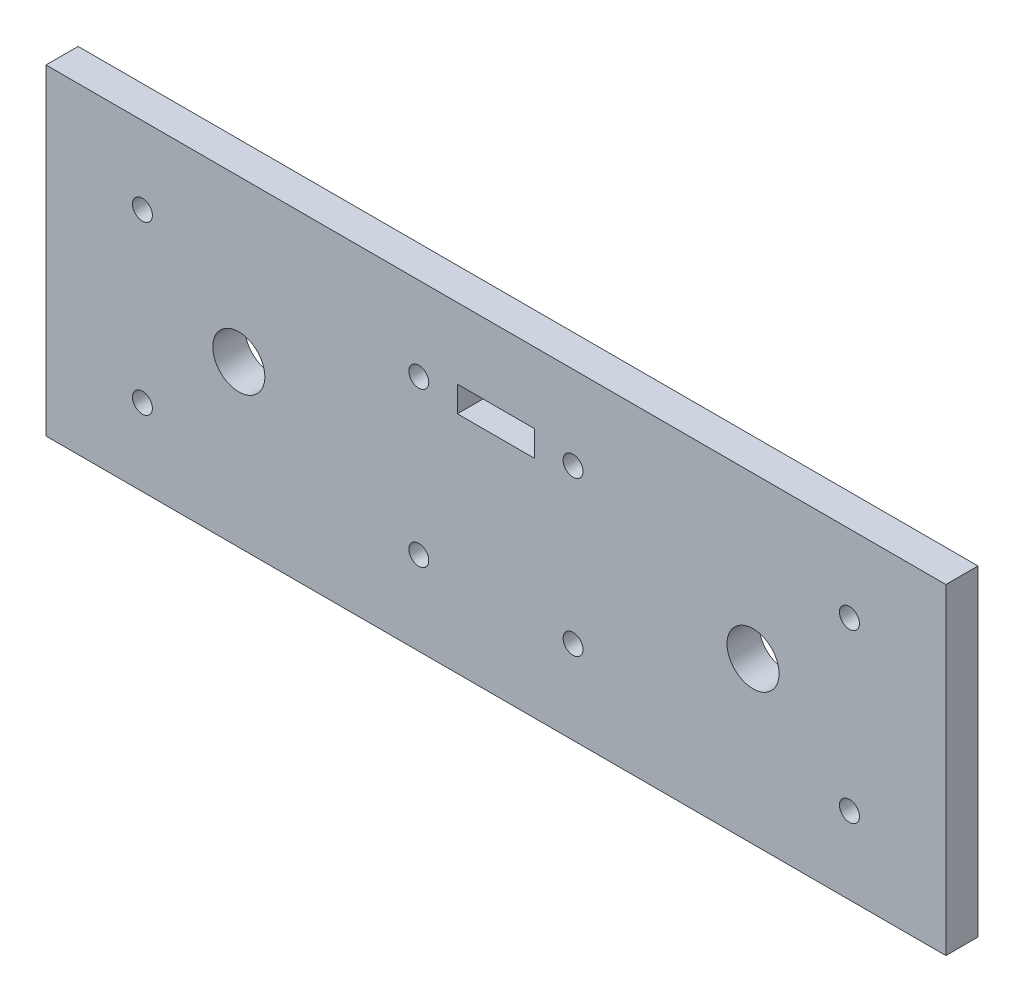
ISO-10303-21;
HEADER;
FILE_DESCRIPTION(('STEP AP214'),'2;1');
FILE_NAME('part.step','',(''),(''),'','','');
FILE_SCHEMA(('AUTOMOTIVE_DESIGN { 1 0 10303 214 1 1 1 1 }'));
ENDSEC;
DATA;
#1=APPLICATION_CONTEXT('core data for automotive mechanical design processes');
#2=APPLICATION_PROTOCOL_DEFINITION('international standard','automotive_design',2000,#1);
#3=PRODUCT_CONTEXT('',#1,'mechanical');
#4=PRODUCT('Part','Part','',(#3));
#5=PRODUCT_RELATED_PRODUCT_CATEGORY('part','',(#4));
#6=PRODUCT_DEFINITION_FORMATION('','',#4);
#7=PRODUCT_DEFINITION_CONTEXT('part definition',#1,'design');
#8=PRODUCT_DEFINITION('design','',#6,#7);
#9=PRODUCT_DEFINITION_SHAPE('','',#8);
#10=(LENGTH_UNIT() NAMED_UNIT(*) SI_UNIT(.MILLI.,.METRE.));
#11=(NAMED_UNIT(*) PLANE_ANGLE_UNIT() SI_UNIT($,.RADIAN.));
#12=(NAMED_UNIT(*) SI_UNIT($,.STERADIAN.) SOLID_ANGLE_UNIT());
#13=UNCERTAINTY_MEASURE_WITH_UNIT(LENGTH_MEASURE(1.E-05),#10,'distance_accuracy_value','');
#14=(GEOMETRIC_REPRESENTATION_CONTEXT(3) GLOBAL_UNCERTAINTY_ASSIGNED_CONTEXT((#13)) GLOBAL_UNIT_ASSIGNED_CONTEXT((#10,
#11,#12)) REPRESENTATION_CONTEXT('',''));
#15=CARTESIAN_POINT('',(0.,0.,0.));
#16=DIRECTION('',(0.,0.,1.));
#17=DIRECTION('',(1.,0.,0.));
#18=AXIS2_PLACEMENT_3D('',#15,#16,#17);
#19=CARTESIAN_POINT('',(70.,-25.,-5.));
#20=DIRECTION('',(1.,0.,0.));
#21=DIRECTION('',(0.,0.,-1.));
#22=AXIS2_PLACEMENT_3D('',#19,#20,#21);
#23=PLANE('',#22);
#24=DIRECTION('',(0.,1.,0.));
#25=VECTOR('',#24,1.);
#26=CARTESIAN_POINT('',(70.,-25.,0.));
#27=LINE('',#26,#25);
#28=CARTESIAN_POINT('',(70.,-25.,0.));
#29=VERTEX_POINT('',#28);
#30=CARTESIAN_POINT('',(70.,25.,0.));
#31=VERTEX_POINT('',#30);
#32=EDGE_CURVE('E145',#29,#31,#27,.T.);
#33=ORIENTED_EDGE('',*,*,#32,.F.);
#34=DIRECTION('',(0.,0.,1.));
#35=VECTOR('',#34,1.);
#36=CARTESIAN_POINT('',(70.,-25.,-5.));
#37=LINE('',#36,#35);
#38=CARTESIAN_POINT('',(70.,-25.,-5.));
#39=VERTEX_POINT('',#38);
#40=EDGE_CURVE('E13',#39,#29,#37,.T.);
#41=ORIENTED_EDGE('',*,*,#40,.F.);
#42=DIRECTION('',(0.,1.,0.));
#43=VECTOR('',#42,1.);
#44=CARTESIAN_POINT('',(70.,-25.,-5.));
#45=LINE('',#44,#43);
#46=CARTESIAN_POINT('',(70.,25.,-5.));
#47=VERTEX_POINT('',#46);
#48=EDGE_CURVE('E149',#39,#47,#45,.T.);
#49=ORIENTED_EDGE('',*,*,#48,.T.);
#50=DIRECTION('',(0.,0.,1.));
#51=VECTOR('',#50,1.);
#52=CARTESIAN_POINT('',(70.,25.,-5.));
#53=LINE('',#52,#51);
#54=EDGE_CURVE('E46',#47,#31,#53,.T.);
#55=ORIENTED_EDGE('',*,*,#54,.T.);
#56=EDGE_LOOP('',(#33,#41,#49,#55));
#57=FACE_BOUND('',#56,.T.);
#58=ADVANCED_FACE('F43',(#57),#23,.T.);
#59=CARTESIAN_POINT('',(-70.,-25.,-5.));
#60=DIRECTION('',(0.,-1.,0.));
#61=DIRECTION('',(0.,0.,-1.));
#62=AXIS2_PLACEMENT_3D('',#59,#60,#61);
#63=PLANE('',#62);
#64=DIRECTION('',(1.,0.,0.));
#65=VECTOR('',#64,1.);
#66=CARTESIAN_POINT('',(-70.,-25.,0.));
#67=LINE('',#66,#65);
#68=CARTESIAN_POINT('',(-70.,-25.,0.));
#69=VERTEX_POINT('',#68);
#70=EDGE_CURVE('E153',#69,#29,#67,.T.);
#71=ORIENTED_EDGE('',*,*,#70,.F.);
#72=DIRECTION('',(0.,0.,1.));
#73=VECTOR('',#72,1.);
#74=CARTESIAN_POINT('',(-70.,-25.,-5.));
#75=LINE('',#74,#73);
#76=CARTESIAN_POINT('',(-70.,-25.,-5.));
#77=VERTEX_POINT('',#76);
#78=EDGE_CURVE('E51',#77,#69,#75,.T.);
#79=ORIENTED_EDGE('',*,*,#78,.F.);
#80=DIRECTION('',(1.,0.,0.));
#81=VECTOR('',#80,1.);
#82=CARTESIAN_POINT('',(-70.,-25.,-5.));
#83=LINE('',#82,#81);
#84=EDGE_CURVE('E159',#77,#39,#83,.T.);
#85=ORIENTED_EDGE('',*,*,#84,.T.);
#86=ORIENTED_EDGE('',*,*,#40,.T.);
#87=EDGE_LOOP('',(#71,#79,#85,#86));
#88=FACE_BOUND('',#87,.T.);
#89=ADVANCED_FACE('F185',(#88),#63,.T.);
#90=CARTESIAN_POINT('',(-70.,-25.,-5.));
#91=DIRECTION('',(-1.,0.,0.));
#92=DIRECTION('',(0.,0.,1.));
#93=AXIS2_PLACEMENT_3D('',#90,#91,#92);
#94=PLANE('',#93);
#95=DIRECTION('',(0.,-1.,0.));
#96=VECTOR('',#95,1.);
#97=CARTESIAN_POINT('',(-70.,-25.,0.));
#98=LINE('',#97,#96);
#99=CARTESIAN_POINT('',(-70.,25.,0.));
#100=VERTEX_POINT('',#99);
#101=EDGE_CURVE('E167',#100,#69,#98,.T.);
#102=ORIENTED_EDGE('',*,*,#101,.F.);
#103=DIRECTION('',(0.,0.,1.));
#104=VECTOR('',#103,1.);
#105=CARTESIAN_POINT('',(-70.,25.,-5.));
#106=LINE('',#105,#104);
#107=CARTESIAN_POINT('',(-70.,25.,-5.));
#108=VERTEX_POINT('',#107);
#109=EDGE_CURVE('E172',#108,#100,#106,.T.);
#110=ORIENTED_EDGE('',*,*,#109,.F.);
#111=DIRECTION('',(0.,-1.,0.));
#112=VECTOR('',#111,1.);
#113=CARTESIAN_POINT('',(-70.,-25.,-5.));
#114=LINE('',#113,#112);
#115=EDGE_CURVE('E156',#108,#77,#114,.T.);
#116=ORIENTED_EDGE('',*,*,#115,.T.);
#117=ORIENTED_EDGE('',*,*,#78,.T.);
#118=EDGE_LOOP('',(#102,#110,#116,#117));
#119=FACE_BOUND('',#118,.T.);
#120=ADVANCED_FACE('F189',(#119),#94,.T.);
#121=CARTESIAN_POINT('',(-70.,25.,-5.));
#122=DIRECTION('',(0.,1.,0.));
#123=DIRECTION('',(0.,0.,1.));
#124=AXIS2_PLACEMENT_3D('',#121,#122,#123);
#125=PLANE('',#124);
#126=DIRECTION('',(-1.,0.,0.));
#127=VECTOR('',#126,1.);
#128=CARTESIAN_POINT('',(-70.,25.,0.));
#129=LINE('',#128,#127);
#130=EDGE_CURVE('E164',#31,#100,#129,.T.);
#131=ORIENTED_EDGE('',*,*,#130,.F.);
#132=ORIENTED_EDGE('',*,*,#54,.F.);
#133=DIRECTION('',(-1.,0.,0.));
#134=VECTOR('',#133,1.);
#135=CARTESIAN_POINT('',(-70.,25.,-5.));
#136=LINE('',#135,#134);
#137=EDGE_CURVE('E152',#47,#108,#136,.T.);
#138=ORIENTED_EDGE('',*,*,#137,.T.);
#139=ORIENTED_EDGE('',*,*,#109,.T.);
#140=EDGE_LOOP('',(#131,#132,#138,#139));
#141=FACE_BOUND('',#140,.T.);
#142=ADVANCED_FACE('F180',(#141),#125,.T.);
#143=CARTESIAN_POINT('',(0.,0.,-5.));
#144=DIRECTION('',(0.,0.,-1.));
#145=DIRECTION('',(-1.,0.,0.));
#146=AXIS2_PLACEMENT_3D('',#143,#144,#145);
#147=PLANE('',#146);
#148=CARTESIAN_POINT('',(12.,12.,-5.));
#149=DIRECTION('',(0.,0.,1.));
#150=DIRECTION('',(-1.,0.,0.));
#151=AXIS2_PLACEMENT_3D('',#148,#149,#150);
#152=CIRCLE('',#151,1.55);
#153=CARTESIAN_POINT('',(10.45,12.,-5.));
#154=VERTEX_POINT('',#153);
#155=EDGE_CURVE('E374',#154,#154,#152,.T.);
#156=ORIENTED_EDGE('',*,*,#155,.T.);
#157=EDGE_LOOP('',(#156));
#158=FACE_BOUND('',#157,.T.);
#159=CARTESIAN_POINT('',(12.,-12.,-5.));
#160=DIRECTION('',(0.,0.,1.));
#161=DIRECTION('',(1.,0.,0.));
#162=AXIS2_PLACEMENT_3D('',#159,#160,#161);
#163=CIRCLE('',#162,1.55);
#164=CARTESIAN_POINT('',(13.55,-12.,-5.));
#165=VERTEX_POINT('',#164);
#166=EDGE_CURVE('E382',#165,#165,#163,.T.);
#167=ORIENTED_EDGE('',*,*,#166,.T.);
#168=EDGE_LOOP('',(#167));
#169=FACE_BOUND('',#168,.T.);
#170=CARTESIAN_POINT('',(-12.,-12.,-5.));
#171=DIRECTION('',(0.,0.,1.));
#172=DIRECTION('',(-1.,0.,0.));
#173=AXIS2_PLACEMENT_3D('',#170,#171,#172);
#174=CIRCLE('',#173,1.55);
#175=CARTESIAN_POINT('',(-13.55,-12.,-5.));
#176=VERTEX_POINT('',#175);
#177=EDGE_CURVE('E388',#176,#176,#174,.T.);
#178=ORIENTED_EDGE('',*,*,#177,.T.);
#179=EDGE_LOOP('',(#178));
#180=FACE_BOUND('',#179,.T.);
#181=CARTESIAN_POINT('',(-55.,-13.,-5.));
#182=DIRECTION('',(0.,0.,1.));
#183=DIRECTION('',(1.,0.,0.));
#184=AXIS2_PLACEMENT_3D('',#181,#182,#183);
#185=CIRCLE('',#184,1.55);
#186=CARTESIAN_POINT('',(-53.45,-13.,-5.));
#187=VERTEX_POINT('',#186);
#188=EDGE_CURVE('E394',#187,#187,#185,.T.);
#189=ORIENTED_EDGE('',*,*,#188,.T.);
#190=EDGE_LOOP('',(#189));
#191=FACE_BOUND('',#190,.T.);
#192=CARTESIAN_POINT('',(-12.,12.,-5.));
#193=DIRECTION('',(0.,0.,1.));
#194=DIRECTION('',(1.,0.,0.));
#195=AXIS2_PLACEMENT_3D('',#192,#193,#194);
#196=CIRCLE('',#195,1.55);
#197=CARTESIAN_POINT('',(-10.45,12.,-5.));
#198=VERTEX_POINT('',#197);
#199=EDGE_CURVE('E400',#198,#198,#196,.T.);
#200=ORIENTED_EDGE('',*,*,#199,.T.);
#201=EDGE_LOOP('',(#200));
#202=FACE_BOUND('',#201,.T.);
#203=CARTESIAN_POINT('',(55.,13.,-5.));
#204=DIRECTION('',(0.,0.,1.));
#205=DIRECTION('',(1.,0.,0.));
#206=AXIS2_PLACEMENT_3D('',#203,#204,#205);
#207=CIRCLE('',#206,1.55);
#208=CARTESIAN_POINT('',(56.55,13.,-5.));
#209=VERTEX_POINT('',#208);
#210=EDGE_CURVE('E406',#209,#209,#207,.T.);
#211=ORIENTED_EDGE('',*,*,#210,.T.);
#212=EDGE_LOOP('',(#211));
#213=FACE_BOUND('',#212,.T.);
#214=CARTESIAN_POINT('',(55.,-13.,-5.));
#215=DIRECTION('',(0.,0.,1.));
#216=DIRECTION('',(-1.,0.,0.));
#217=AXIS2_PLACEMENT_3D('',#214,#215,#216);
#218=CIRCLE('',#217,1.55);
#219=CARTESIAN_POINT('',(53.45,-13.,-5.));
#220=VERTEX_POINT('',#219);
#221=EDGE_CURVE('E412',#220,#220,#218,.T.);
#222=ORIENTED_EDGE('',*,*,#221,.T.);
#223=EDGE_LOOP('',(#222));
#224=FACE_BOUND('',#223,.T.);
#225=CARTESIAN_POINT('',(-55.,13.,-5.));
#226=DIRECTION('',(0.,0.,1.));
#227=DIRECTION('',(-1.,0.,0.));
#228=AXIS2_PLACEMENT_3D('',#225,#226,#227);
#229=CIRCLE('',#228,1.55);
#230=CARTESIAN_POINT('',(-56.55,13.,-5.));
#231=VERTEX_POINT('',#230);
#232=EDGE_CURVE('E418',#231,#231,#229,.T.);
#233=ORIENTED_EDGE('',*,*,#232,.T.);
#234=EDGE_LOOP('',(#233));
#235=FACE_BOUND('',#234,.T.);
#236=CARTESIAN_POINT('',(40.,0.,-5.));
#237=DIRECTION('',(0.,0.,1.));
#238=DIRECTION('',(-1.,0.,0.));
#239=AXIS2_PLACEMENT_3D('',#236,#237,#238);
#240=CIRCLE('',#239,4.05);
#241=CARTESIAN_POINT('',(35.95,0.,-5.));
#242=VERTEX_POINT('',#241);
#243=EDGE_CURVE('E424',#242,#242,#240,.T.);
#244=ORIENTED_EDGE('',*,*,#243,.T.);
#245=EDGE_LOOP('',(#244));
#246=FACE_BOUND('',#245,.T.);
#247=CARTESIAN_POINT('',(-40.,0.,-5.));
#248=DIRECTION('',(0.,0.,1.));
#249=DIRECTION('',(1.,0.,0.));
#250=AXIS2_PLACEMENT_3D('',#247,#248,#249);
#251=CIRCLE('',#250,4.05);
#252=CARTESIAN_POINT('',(-35.95,0.,-5.));
#253=VERTEX_POINT('',#252);
#254=EDGE_CURVE('E139',#253,#253,#251,.T.);
#255=ORIENTED_EDGE('',*,*,#254,.T.);
#256=EDGE_LOOP('',(#255));
#257=FACE_BOUND('',#256,.T.);
#258=DIRECTION('',(0.,1.,0.));
#259=VECTOR('',#258,1.);
#260=CARTESIAN_POINT('',(5.99999999999998,10.,-5.));
#261=LINE('',#260,#259);
#262=CARTESIAN_POINT('',(5.99999999999998,10.,-5.));
#263=VERTEX_POINT('',#262);
#264=CARTESIAN_POINT('',(5.99999999999998,14.,-5.));
#265=VERTEX_POINT('',#264);
#266=EDGE_CURVE('E110',#263,#265,#261,.T.);
#267=ORIENTED_EDGE('',*,*,#266,.T.);
#268=DIRECTION('',(-1.,0.,0.));
#269=VECTOR('',#268,1.);
#270=CARTESIAN_POINT('',(-6.00000000000002,14.,-5.));
#271=LINE('',#270,#269);
#272=CARTESIAN_POINT('',(-6.00000000000002,14.,-5.));
#273=VERTEX_POINT('',#272);
#274=EDGE_CURVE('E119',#265,#273,#271,.T.);
#275=ORIENTED_EDGE('',*,*,#274,.T.);
#276=DIRECTION('',(0.,-1.,0.));
#277=VECTOR('',#276,1.);
#278=CARTESIAN_POINT('',(-6.00000000000002,10.,-5.));
#279=LINE('',#278,#277);
#280=CARTESIAN_POINT('',(-6.00000000000002,10.,-5.));
#281=VERTEX_POINT('',#280);
#282=EDGE_CURVE('E59',#273,#281,#279,.T.);
#283=ORIENTED_EDGE('',*,*,#282,.T.);
#284=DIRECTION('',(1.,0.,0.));
#285=VECTOR('',#284,1.);
#286=CARTESIAN_POINT('',(-6.00000000000002,10.,-5.));
#287=LINE('',#286,#285);
#288=EDGE_CURVE('E116',#281,#263,#287,.T.);
#289=ORIENTED_EDGE('',*,*,#288,.T.);
#290=EDGE_LOOP('',(#267,#275,#283,#289));
#291=FACE_BOUND('',#290,.T.);
#292=ORIENTED_EDGE('',*,*,#48,.F.);
#293=ORIENTED_EDGE('',*,*,#84,.F.);
#294=ORIENTED_EDGE('',*,*,#115,.F.);
#295=ORIENTED_EDGE('',*,*,#137,.F.);
#296=EDGE_LOOP('',(#292,#293,#294,#295));
#297=FACE_BOUND('',#296,.T.);
#298=ADVANCED_FACE('F123',(#158,#169,#180,#191,#202,#213,#224,#235,#246,#257,#291,#297),#147,.T.);
#299=CARTESIAN_POINT('',(0.,0.,0.));
#300=DIRECTION('',(0.,0.,-1.));
#301=DIRECTION('',(-1.,0.,0.));
#302=AXIS2_PLACEMENT_3D('',#299,#300,#301);
#303=PLANE('',#302);
#304=CARTESIAN_POINT('',(12.,12.,0.));
#305=DIRECTION('',(0.,0.,1.));
#306=DIRECTION('',(-1.,0.,0.));
#307=AXIS2_PLACEMENT_3D('',#304,#305,#306);
#308=CIRCLE('',#307,1.55);
#309=CARTESIAN_POINT('',(10.45,12.,0.));
#310=VERTEX_POINT('',#309);
#311=EDGE_CURVE('E377',#310,#310,#308,.T.);
#312=ORIENTED_EDGE('',*,*,#311,.F.);
#313=EDGE_LOOP('',(#312));
#314=FACE_BOUND('',#313,.T.);
#315=CARTESIAN_POINT('',(12.,-12.,0.));
#316=DIRECTION('',(0.,0.,1.));
#317=DIRECTION('',(1.,0.,0.));
#318=AXIS2_PLACEMENT_3D('',#315,#316,#317);
#319=CIRCLE('',#318,1.55);
#320=CARTESIAN_POINT('',(13.55,-12.,0.));
#321=VERTEX_POINT('',#320);
#322=EDGE_CURVE('E379',#321,#321,#319,.T.);
#323=ORIENTED_EDGE('',*,*,#322,.F.);
#324=EDGE_LOOP('',(#323));
#325=FACE_BOUND('',#324,.T.);
#326=CARTESIAN_POINT('',(-12.,-12.,0.));
#327=DIRECTION('',(0.,0.,1.));
#328=DIRECTION('',(-1.,0.,0.));
#329=AXIS2_PLACEMENT_3D('',#326,#327,#328);
#330=CIRCLE('',#329,1.55);
#331=CARTESIAN_POINT('',(-13.55,-12.,0.));
#332=VERTEX_POINT('',#331);
#333=EDGE_CURVE('E385',#332,#332,#330,.T.);
#334=ORIENTED_EDGE('',*,*,#333,.F.);
#335=EDGE_LOOP('',(#334));
#336=FACE_BOUND('',#335,.T.);
#337=CARTESIAN_POINT('',(-55.,-13.,0.));
#338=DIRECTION('',(0.,0.,1.));
#339=DIRECTION('',(1.,0.,0.));
#340=AXIS2_PLACEMENT_3D('',#337,#338,#339);
#341=CIRCLE('',#340,1.55);
#342=CARTESIAN_POINT('',(-53.45,-13.,0.));
#343=VERTEX_POINT('',#342);
#344=EDGE_CURVE('E391',#343,#343,#341,.T.);
#345=ORIENTED_EDGE('',*,*,#344,.F.);
#346=EDGE_LOOP('',(#345));
#347=FACE_BOUND('',#346,.T.);
#348=CARTESIAN_POINT('',(-12.,12.,0.));
#349=DIRECTION('',(0.,0.,1.));
#350=DIRECTION('',(1.,0.,0.));
#351=AXIS2_PLACEMENT_3D('',#348,#349,#350);
#352=CIRCLE('',#351,1.55);
#353=CARTESIAN_POINT('',(-10.45,12.,0.));
#354=VERTEX_POINT('',#353);
#355=EDGE_CURVE('E397',#354,#354,#352,.T.);
#356=ORIENTED_EDGE('',*,*,#355,.F.);
#357=EDGE_LOOP('',(#356));
#358=FACE_BOUND('',#357,.T.);
#359=CARTESIAN_POINT('',(55.,13.,0.));
#360=DIRECTION('',(0.,0.,1.));
#361=DIRECTION('',(1.,0.,0.));
#362=AXIS2_PLACEMENT_3D('',#359,#360,#361);
#363=CIRCLE('',#362,1.55);
#364=CARTESIAN_POINT('',(56.55,13.,0.));
#365=VERTEX_POINT('',#364);
#366=EDGE_CURVE('E403',#365,#365,#363,.T.);
#367=ORIENTED_EDGE('',*,*,#366,.F.);
#368=EDGE_LOOP('',(#367));
#369=FACE_BOUND('',#368,.T.);
#370=CARTESIAN_POINT('',(55.,-13.,0.));
#371=DIRECTION('',(0.,0.,1.));
#372=DIRECTION('',(-1.,0.,0.));
#373=AXIS2_PLACEMENT_3D('',#370,#371,#372);
#374=CIRCLE('',#373,1.55);
#375=CARTESIAN_POINT('',(53.45,-13.,0.));
#376=VERTEX_POINT('',#375);
#377=EDGE_CURVE('E409',#376,#376,#374,.T.);
#378=ORIENTED_EDGE('',*,*,#377,.F.);
#379=EDGE_LOOP('',(#378));
#380=FACE_BOUND('',#379,.T.);
#381=CARTESIAN_POINT('',(-55.,13.,0.));
#382=DIRECTION('',(0.,0.,1.));
#383=DIRECTION('',(-1.,0.,0.));
#384=AXIS2_PLACEMENT_3D('',#381,#382,#383);
#385=CIRCLE('',#384,1.55);
#386=CARTESIAN_POINT('',(-56.55,13.,0.));
#387=VERTEX_POINT('',#386);
#388=EDGE_CURVE('E415',#387,#387,#385,.T.);
#389=ORIENTED_EDGE('',*,*,#388,.F.);
#390=EDGE_LOOP('',(#389));
#391=FACE_BOUND('',#390,.T.);
#392=CARTESIAN_POINT('',(40.,0.,0.));
#393=DIRECTION('',(0.,0.,1.));
#394=DIRECTION('',(-1.,0.,0.));
#395=AXIS2_PLACEMENT_3D('',#392,#393,#394);
#396=CIRCLE('',#395,4.05);
#397=CARTESIAN_POINT('',(35.95,0.,0.));
#398=VERTEX_POINT('',#397);
#399=EDGE_CURVE('E421',#398,#398,#396,.T.);
#400=ORIENTED_EDGE('',*,*,#399,.F.);
#401=EDGE_LOOP('',(#400));
#402=FACE_BOUND('',#401,.T.);
#403=CARTESIAN_POINT('',(-40.,0.,0.));
#404=DIRECTION('',(0.,0.,1.));
#405=DIRECTION('',(1.,0.,0.));
#406=AXIS2_PLACEMENT_3D('',#403,#404,#405);
#407=CIRCLE('',#406,4.05);
#408=CARTESIAN_POINT('',(-35.95,0.,0.));
#409=VERTEX_POINT('',#408);
#410=EDGE_CURVE('E132',#409,#409,#407,.T.);
#411=ORIENTED_EDGE('',*,*,#410,.F.);
#412=EDGE_LOOP('',(#411));
#413=FACE_BOUND('',#412,.T.);
#414=DIRECTION('',(-1.,0.,0.));
#415=VECTOR('',#414,1.);
#416=CARTESIAN_POINT('',(-6.00000000000002,14.,0.));
#417=LINE('',#416,#415);
#418=CARTESIAN_POINT('',(5.99999999999998,14.,0.));
#419=VERTEX_POINT('',#418);
#420=CARTESIAN_POINT('',(-6.00000000000002,14.,0.));
#421=VERTEX_POINT('',#420);
#422=EDGE_CURVE('E138',#419,#421,#417,.T.);
#423=ORIENTED_EDGE('',*,*,#422,.F.);
#424=DIRECTION('',(0.,1.,0.));
#425=VECTOR('',#424,1.);
#426=CARTESIAN_POINT('',(5.99999999999998,10.,0.));
#427=LINE('',#426,#425);
#428=CARTESIAN_POINT('',(5.99999999999998,10.,0.));
#429=VERTEX_POINT('',#428);
#430=EDGE_CURVE('E67',#429,#419,#427,.T.);
#431=ORIENTED_EDGE('',*,*,#430,.F.);
#432=DIRECTION('',(1.,0.,0.));
#433=VECTOR('',#432,1.);
#434=CARTESIAN_POINT('',(-6.00000000000002,10.,0.));
#435=LINE('',#434,#433);
#436=CARTESIAN_POINT('',(-6.00000000000002,10.,0.));
#437=VERTEX_POINT('',#436);
#438=EDGE_CURVE('E126',#437,#429,#435,.T.);
#439=ORIENTED_EDGE('',*,*,#438,.F.);
#440=DIRECTION('',(0.,-1.,0.));
#441=VECTOR('',#440,1.);
#442=CARTESIAN_POINT('',(-6.00000000000002,10.,0.));
#443=LINE('',#442,#441);
#444=EDGE_CURVE('E129',#421,#437,#443,.T.);
#445=ORIENTED_EDGE('',*,*,#444,.F.);
#446=EDGE_LOOP('',(#423,#431,#439,#445));
#447=FACE_BOUND('',#446,.T.);
#448=ORIENTED_EDGE('',*,*,#32,.T.);
#449=ORIENTED_EDGE('',*,*,#130,.T.);
#450=ORIENTED_EDGE('',*,*,#101,.T.);
#451=ORIENTED_EDGE('',*,*,#70,.T.);
#452=EDGE_LOOP('',(#448,#449,#450,#451));
#453=FACE_BOUND('',#452,.T.);
#454=ADVANCED_FACE('F182',(#314,#325,#336,#347,#358,#369,#380,#391,#402,#413,#447,#453),#303,.F.);
#455=CARTESIAN_POINT('',(5.99999999999998,10.,-5.));
#456=DIRECTION('',(1.,0.,0.));
#457=DIRECTION('',(0.,0.,-1.));
#458=AXIS2_PLACEMENT_3D('',#455,#456,#457);
#459=PLANE('',#458);
#460=ORIENTED_EDGE('',*,*,#430,.T.);
#461=DIRECTION('',(0.,0.,1.));
#462=VECTOR('',#461,1.);
#463=CARTESIAN_POINT('',(5.99999999999998,14.,-5.));
#464=LINE('',#463,#462);
#465=EDGE_CURVE('E106',#265,#419,#464,.T.);
#466=ORIENTED_EDGE('',*,*,#465,.F.);
#467=ORIENTED_EDGE('',*,*,#266,.F.);
#468=DIRECTION('',(0.,0.,1.));
#469=VECTOR('',#468,1.);
#470=CARTESIAN_POINT('',(5.99999999999998,10.,-5.));
#471=LINE('',#470,#469);
#472=EDGE_CURVE('E143',#263,#429,#471,.T.);
#473=ORIENTED_EDGE('',*,*,#472,.T.);
#474=EDGE_LOOP('',(#460,#466,#467,#473));
#475=FACE_BOUND('',#474,.T.);
#476=ADVANCED_FACE('F108',(#475),#459,.F.);
#477=CARTESIAN_POINT('',(-6.00000000000002,10.,-5.));
#478=DIRECTION('',(0.,-1.,0.));
#479=DIRECTION('',(0.,0.,-1.));
#480=AXIS2_PLACEMENT_3D('',#477,#478,#479);
#481=PLANE('',#480);
#482=ORIENTED_EDGE('',*,*,#438,.T.);
#483=ORIENTED_EDGE('',*,*,#472,.F.);
#484=ORIENTED_EDGE('',*,*,#288,.F.);
#485=DIRECTION('',(0.,0.,1.));
#486=VECTOR('',#485,1.);
#487=CARTESIAN_POINT('',(-6.00000000000002,10.,-5.));
#488=LINE('',#487,#486);
#489=EDGE_CURVE('E146',#281,#437,#488,.T.);
#490=ORIENTED_EDGE('',*,*,#489,.T.);
#491=EDGE_LOOP('',(#482,#483,#484,#490));
#492=FACE_BOUND('',#491,.T.);
#493=ADVANCED_FACE('F241',(#492),#481,.F.);
#494=CARTESIAN_POINT('',(-6.00000000000002,10.,-5.));
#495=DIRECTION('',(-1.,0.,0.));
#496=DIRECTION('',(0.,0.,1.));
#497=AXIS2_PLACEMENT_3D('',#494,#495,#496);
#498=PLANE('',#497);
#499=ORIENTED_EDGE('',*,*,#444,.T.);
#500=ORIENTED_EDGE('',*,*,#489,.F.);
#501=ORIENTED_EDGE('',*,*,#282,.F.);
#502=DIRECTION('',(0.,0.,1.));
#503=VECTOR('',#502,1.);
#504=CARTESIAN_POINT('',(-6.00000000000002,14.,-5.));
#505=LINE('',#504,#503);
#506=EDGE_CURVE('E115',#273,#421,#505,.T.);
#507=ORIENTED_EDGE('',*,*,#506,.T.);
#508=EDGE_LOOP('',(#499,#500,#501,#507));
#509=FACE_BOUND('',#508,.T.);
#510=ADVANCED_FACE('F250',(#509),#498,.F.);
#511=CARTESIAN_POINT('',(-6.00000000000002,14.,-5.));
#512=DIRECTION('',(0.,1.,0.));
#513=DIRECTION('',(0.,0.,1.));
#514=AXIS2_PLACEMENT_3D('',#511,#512,#513);
#515=PLANE('',#514);
#516=ORIENTED_EDGE('',*,*,#422,.T.);
#517=ORIENTED_EDGE('',*,*,#506,.F.);
#518=ORIENTED_EDGE('',*,*,#274,.F.);
#519=ORIENTED_EDGE('',*,*,#465,.T.);
#520=EDGE_LOOP('',(#516,#517,#518,#519));
#521=FACE_BOUND('',#520,.T.);
#522=ADVANCED_FACE('F120',(#521),#515,.F.);
#523=CARTESIAN_POINT('',(-40.,0.,-5.));
#524=DIRECTION('',(0.,0.,1.));
#525=DIRECTION('',(1.,0.,0.));
#526=AXIS2_PLACEMENT_3D('',#523,#524,#525);
#527=CYLINDRICAL_SURFACE('',#526,4.05);
#528=ORIENTED_EDGE('',*,*,#254,.F.);
#529=EDGE_LOOP('',(#528));
#530=FACE_BOUND('',#529,.T.);
#531=ORIENTED_EDGE('',*,*,#410,.T.);
#532=EDGE_LOOP('',(#531));
#533=FACE_BOUND('',#532,.T.);
#534=ADVANCED_FACE('F268',(#530,#533),#527,.F.);
#535=CARTESIAN_POINT('',(40.,0.,-5.));
#536=DIRECTION('',(0.,0.,1.));
#537=DIRECTION('',(1.,0.,0.));
#538=AXIS2_PLACEMENT_3D('',#535,#536,#537);
#539=CYLINDRICAL_SURFACE('',#538,4.05);
#540=ORIENTED_EDGE('',*,*,#243,.F.);
#541=EDGE_LOOP('',(#540));
#542=FACE_BOUND('',#541,.T.);
#543=ORIENTED_EDGE('',*,*,#399,.T.);
#544=EDGE_LOOP('',(#543));
#545=FACE_BOUND('',#544,.T.);
#546=ADVANCED_FACE('F277',(#542,#545),#539,.F.);
#547=CARTESIAN_POINT('',(-55.,13.,-5.));
#548=DIRECTION('',(0.,0.,1.));
#549=DIRECTION('',(1.,0.,0.));
#550=AXIS2_PLACEMENT_3D('',#547,#548,#549);
#551=CYLINDRICAL_SURFACE('',#550,1.55);
#552=ORIENTED_EDGE('',*,*,#232,.F.);
#553=EDGE_LOOP('',(#552));
#554=FACE_BOUND('',#553,.T.);
#555=ORIENTED_EDGE('',*,*,#388,.T.);
#556=EDGE_LOOP('',(#555));
#557=FACE_BOUND('',#556,.T.);
#558=ADVANCED_FACE('F287',(#554,#557),#551,.F.);
#559=CARTESIAN_POINT('',(55.,-13.,-5.));
#560=DIRECTION('',(0.,0.,1.));
#561=DIRECTION('',(1.,0.,0.));
#562=AXIS2_PLACEMENT_3D('',#559,#560,#561);
#563=CYLINDRICAL_SURFACE('',#562,1.55);
#564=ORIENTED_EDGE('',*,*,#221,.F.);
#565=EDGE_LOOP('',(#564));
#566=FACE_BOUND('',#565,.T.);
#567=ORIENTED_EDGE('',*,*,#377,.T.);
#568=EDGE_LOOP('',(#567));
#569=FACE_BOUND('',#568,.T.);
#570=ADVANCED_FACE('F297',(#566,#569),#563,.F.);
#571=CARTESIAN_POINT('',(55.,13.,-5.));
#572=DIRECTION('',(0.,0.,1.));
#573=DIRECTION('',(1.,0.,0.));
#574=AXIS2_PLACEMENT_3D('',#571,#572,#573);
#575=CYLINDRICAL_SURFACE('',#574,1.55);
#576=ORIENTED_EDGE('',*,*,#210,.F.);
#577=EDGE_LOOP('',(#576));
#578=FACE_BOUND('',#577,.T.);
#579=ORIENTED_EDGE('',*,*,#366,.T.);
#580=EDGE_LOOP('',(#579));
#581=FACE_BOUND('',#580,.T.);
#582=ADVANCED_FACE('F307',(#578,#581),#575,.F.);
#583=CARTESIAN_POINT('',(-12.,12.,-5.));
#584=DIRECTION('',(0.,0.,1.));
#585=DIRECTION('',(1.,0.,0.));
#586=AXIS2_PLACEMENT_3D('',#583,#584,#585);
#587=CYLINDRICAL_SURFACE('',#586,1.55);
#588=ORIENTED_EDGE('',*,*,#199,.F.);
#589=EDGE_LOOP('',(#588));
#590=FACE_BOUND('',#589,.T.);
#591=ORIENTED_EDGE('',*,*,#355,.T.);
#592=EDGE_LOOP('',(#591));
#593=FACE_BOUND('',#592,.T.);
#594=ADVANCED_FACE('F317',(#590,#593),#587,.F.);
#595=CARTESIAN_POINT('',(-55.,-13.,-5.));
#596=DIRECTION('',(0.,0.,1.));
#597=DIRECTION('',(1.,0.,0.));
#598=AXIS2_PLACEMENT_3D('',#595,#596,#597);
#599=CYLINDRICAL_SURFACE('',#598,1.55);
#600=ORIENTED_EDGE('',*,*,#188,.F.);
#601=EDGE_LOOP('',(#600));
#602=FACE_BOUND('',#601,.T.);
#603=ORIENTED_EDGE('',*,*,#344,.T.);
#604=EDGE_LOOP('',(#603));
#605=FACE_BOUND('',#604,.T.);
#606=ADVANCED_FACE('F327',(#602,#605),#599,.F.);
#607=CARTESIAN_POINT('',(-12.,-12.,-5.));
#608=DIRECTION('',(0.,0.,1.));
#609=DIRECTION('',(1.,0.,0.));
#610=AXIS2_PLACEMENT_3D('',#607,#608,#609);
#611=CYLINDRICAL_SURFACE('',#610,1.55);
#612=ORIENTED_EDGE('',*,*,#177,.F.);
#613=EDGE_LOOP('',(#612));
#614=FACE_BOUND('',#613,.T.);
#615=ORIENTED_EDGE('',*,*,#333,.T.);
#616=EDGE_LOOP('',(#615));
#617=FACE_BOUND('',#616,.T.);
#618=ADVANCED_FACE('F337',(#614,#617),#611,.F.);
#619=CARTESIAN_POINT('',(12.,-12.,-5.));
#620=DIRECTION('',(0.,0.,1.));
#621=DIRECTION('',(1.,0.,0.));
#622=AXIS2_PLACEMENT_3D('',#619,#620,#621);
#623=CYLINDRICAL_SURFACE('',#622,1.55);
#624=ORIENTED_EDGE('',*,*,#166,.F.);
#625=EDGE_LOOP('',(#624));
#626=FACE_BOUND('',#625,.T.);
#627=ORIENTED_EDGE('',*,*,#322,.T.);
#628=EDGE_LOOP('',(#627));
#629=FACE_BOUND('',#628,.T.);
#630=ADVANCED_FACE('F347',(#626,#629),#623,.F.);
#631=CARTESIAN_POINT('',(12.,12.,-5.));
#632=DIRECTION('',(0.,0.,1.));
#633=DIRECTION('',(1.,0.,0.));
#634=AXIS2_PLACEMENT_3D('',#631,#632,#633);
#635=CYLINDRICAL_SURFACE('',#634,1.55);
#636=ORIENTED_EDGE('',*,*,#155,.F.);
#637=EDGE_LOOP('',(#636));
#638=FACE_BOUND('',#637,.T.);
#639=ORIENTED_EDGE('',*,*,#311,.T.);
#640=EDGE_LOOP('',(#639));
#641=FACE_BOUND('',#640,.T.);
#642=ADVANCED_FACE('F357',(#638,#641),#635,.F.);
#643=CLOSED_SHELL('',(#58,#89,#120,#142,#298,#454,#476,#493,#510,#522,#534,#546,#558,#570,#582,
#594,#606,#618,#630,#642));
#644=MANIFOLD_SOLID_BREP('B2',#643);
#645=ADVANCED_BREP_SHAPE_REPRESENTATION('',(#18,#644),#14);
#646=SHAPE_DEFINITION_REPRESENTATION(#9,#645);
ENDSEC;
END-ISO-10303-21;
